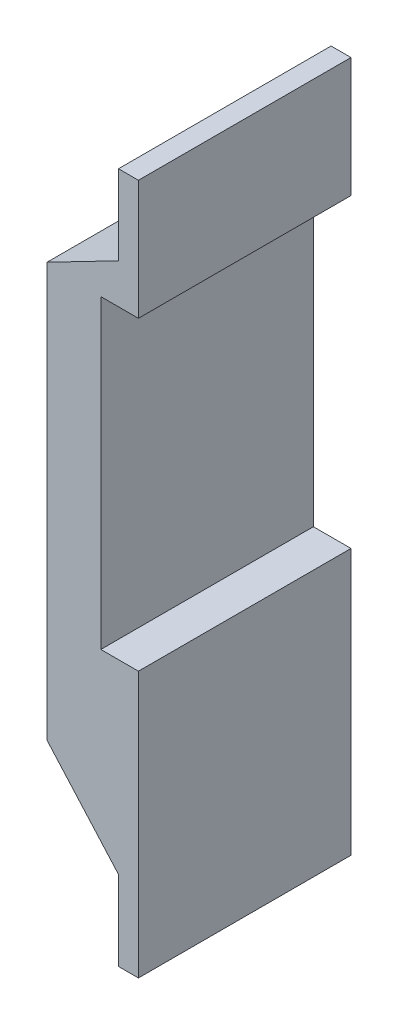
ISO-10303-21;
HEADER;
FILE_DESCRIPTION(('STEP AP214'),'2;1');
FILE_NAME('part.step','',(''),(''),'','','');
FILE_SCHEMA(('AUTOMOTIVE_DESIGN { 1 0 10303 214 1 1 1 1 }'));
ENDSEC;
DATA;
#1=APPLICATION_CONTEXT('core data for automotive mechanical design processes');
#2=APPLICATION_PROTOCOL_DEFINITION('international standard','automotive_design',2000,#1);
#3=PRODUCT_CONTEXT('',#1,'mechanical');
#4=PRODUCT('Part','Part','',(#3));
#5=PRODUCT_RELATED_PRODUCT_CATEGORY('part','',(#4));
#6=PRODUCT_DEFINITION_FORMATION('','',#4);
#7=PRODUCT_DEFINITION_CONTEXT('part definition',#1,'design');
#8=PRODUCT_DEFINITION('design','',#6,#7);
#9=PRODUCT_DEFINITION_SHAPE('','',#8);
#10=(LENGTH_UNIT() NAMED_UNIT(*) SI_UNIT(.MILLI.,.METRE.));
#11=(NAMED_UNIT(*) PLANE_ANGLE_UNIT() SI_UNIT($,.RADIAN.));
#12=(NAMED_UNIT(*) SI_UNIT($,.STERADIAN.) SOLID_ANGLE_UNIT());
#13=UNCERTAINTY_MEASURE_WITH_UNIT(LENGTH_MEASURE(1.E-05),#10,'distance_accuracy_value','');
#14=(GEOMETRIC_REPRESENTATION_CONTEXT(3) GLOBAL_UNCERTAINTY_ASSIGNED_CONTEXT((#13)) GLOBAL_UNIT_ASSIGNED_CONTEXT((#10,
#11,#12)) REPRESENTATION_CONTEXT('',''));
#15=CARTESIAN_POINT('',(0.,0.,0.));
#16=DIRECTION('',(0.,0.,1.));
#17=DIRECTION('',(1.,0.,0.));
#18=AXIS2_PLACEMENT_3D('',#15,#16,#17);
#19=CARTESIAN_POINT('',(0.,22.6727268427781,16.));
#20=DIRECTION('',(1.,0.,0.));
#21=DIRECTION('',(0.,1.,0.));
#22=AXIS2_PLACEMENT_3D('',#19,#20,#21);
#23=PLANE('',#22);
#24=DIRECTION('',(0.,-1.,0.));
#25=VECTOR('',#24,1.);
#26=CARTESIAN_POINT('',(0.,22.6727268427781,0.));
#27=LINE('',#26,#25);
#28=CARTESIAN_POINT('',(0.,22.6727268427781,0.));
#29=VERTEX_POINT('',#28);
#30=CARTESIAN_POINT('',(0.,16.6727268427781,0.));
#31=VERTEX_POINT('',#30);
#32=EDGE_CURVE('E157',#29,#31,#27,.T.);
#33=ORIENTED_EDGE('',*,*,#32,.T.);
#34=DIRECTION('',(0.,0.,-1.));
#35=VECTOR('',#34,1.);
#36=CARTESIAN_POINT('',(0.,16.6727268427781,16.));
#37=LINE('',#36,#35);
#38=CARTESIAN_POINT('',(0.,16.6727268427781,16.));
#39=VERTEX_POINT('',#38);
#40=EDGE_CURVE('E11',#39,#31,#37,.T.);
#41=ORIENTED_EDGE('',*,*,#40,.F.);
#42=DIRECTION('',(0.,-1.,0.));
#43=VECTOR('',#42,1.);
#44=CARTESIAN_POINT('',(0.,22.6727268427781,16.));
#45=LINE('',#44,#43);
#46=CARTESIAN_POINT('',(0.,22.6727268427781,16.));
#47=VERTEX_POINT('',#46);
#48=EDGE_CURVE('E179',#47,#39,#45,.T.);
#49=ORIENTED_EDGE('',*,*,#48,.F.);
#50=DIRECTION('',(0.,0.,-1.));
#51=VECTOR('',#50,1.);
#52=CARTESIAN_POINT('',(0.,22.6727268427781,16.));
#53=LINE('',#52,#51);
#54=EDGE_CURVE('E153',#47,#29,#53,.T.);
#55=ORIENTED_EDGE('',*,*,#54,.T.);
#56=EDGE_LOOP('',(#33,#41,#49,#55));
#57=FACE_BOUND('',#56,.T.);
#58=ADVANCED_FACE('F37',(#57),#23,.F.);
#59=CARTESIAN_POINT('',(0.,16.6727268427781,16.));
#60=DIRECTION('',(0.459763152914506,-0.888041577417473,0.));
#61=DIRECTION('',(0.888041577417472,0.459763152914506,0.));
#62=AXIS2_PLACEMENT_3D('',#59,#60,#61);
#63=PLANE('',#62);
#64=DIRECTION('',(-0.888041577417472,-0.459763152914506,0.));
#65=VECTOR('',#64,1.);
#66=CARTESIAN_POINT('',(0.,16.6727268427781,0.));
#67=LINE('',#66,#65);
#68=CARTESIAN_POINT('',(-5.38153195914988,13.8865621361162,0.));
#69=VERTEX_POINT('',#68);
#70=EDGE_CURVE('E160',#31,#69,#67,.T.);
#71=ORIENTED_EDGE('',*,*,#70,.T.);
#72=DIRECTION('',(0.,0.,-1.));
#73=VECTOR('',#72,1.);
#74=CARTESIAN_POINT('',(-5.38153195914988,13.8865621361162,16.));
#75=LINE('',#74,#73);
#76=CARTESIAN_POINT('',(-5.38153195914988,13.8865621361162,16.));
#77=VERTEX_POINT('',#76);
#78=EDGE_CURVE('E45',#77,#69,#75,.T.);
#79=ORIENTED_EDGE('',*,*,#78,.F.);
#80=DIRECTION('',(-0.888041577417472,-0.459763152914506,0.));
#81=VECTOR('',#80,1.);
#82=CARTESIAN_POINT('',(0.,16.6727268427781,16.));
#83=LINE('',#82,#81);
#84=EDGE_CURVE('E108',#39,#77,#83,.T.);
#85=ORIENTED_EDGE('',*,*,#84,.F.);
#86=ORIENTED_EDGE('',*,*,#40,.T.);
#87=EDGE_LOOP('',(#71,#79,#85,#86));
#88=FACE_BOUND('',#87,.T.);
#89=ADVANCED_FACE('F257',(#88),#63,.F.);
#90=CARTESIAN_POINT('',(-5.38153195914988,13.8865621361162,16.));
#91=DIRECTION('',(1.,0.,0.));
#92=DIRECTION('',(0.,1.,0.));
#93=AXIS2_PLACEMENT_3D('',#90,#91,#92);
#94=PLANE('',#93);
#95=DIRECTION('',(0.,-1.,0.));
#96=VECTOR('',#95,1.);
#97=CARTESIAN_POINT('',(-5.38153195914988,13.8865621361162,0.));
#98=LINE('',#97,#96);
#99=CARTESIAN_POINT('',(-5.38153195914988,-17.2672731572219,0.));
#100=VERTEX_POINT('',#99);
#101=EDGE_CURVE('E162',#69,#100,#98,.T.);
#102=ORIENTED_EDGE('',*,*,#101,.T.);
#103=DIRECTION('',(0.,0.,-1.));
#104=VECTOR('',#103,1.);
#105=CARTESIAN_POINT('',(-5.38153195914988,-17.2672731572219,16.));
#106=LINE('',#105,#104);
#107=CARTESIAN_POINT('',(-5.38153195914988,-17.2672731572219,16.));
#108=VERTEX_POINT('',#107);
#109=EDGE_CURVE('E198',#108,#100,#106,.T.);
#110=ORIENTED_EDGE('',*,*,#109,.F.);
#111=DIRECTION('',(0.,-1.,0.));
#112=VECTOR('',#111,1.);
#113=CARTESIAN_POINT('',(-5.38153195914988,13.8865621361162,16.));
#114=LINE('',#113,#112);
#115=EDGE_CURVE('E206',#77,#108,#114,.T.);
#116=ORIENTED_EDGE('',*,*,#115,.F.);
#117=ORIENTED_EDGE('',*,*,#78,.T.);
#118=EDGE_LOOP('',(#102,#110,#116,#117));
#119=FACE_BOUND('',#118,.T.);
#120=ADVANCED_FACE('F204',(#119),#94,.F.);
#121=CARTESIAN_POINT('',(-5.38153195914988,-17.2672731572219,16.));
#122=DIRECTION('',(0.74772382770542,0.664009847428151,0.));
#123=DIRECTION('',(-0.664009847428151,0.74772382770542,0.));
#124=AXIS2_PLACEMENT_3D('',#121,#122,#123);
#125=PLANE('',#124);
#126=DIRECTION('',(0.664009847428151,-0.74772382770542,0.));
#127=VECTOR('',#126,1.);
#128=CARTESIAN_POINT('',(-5.38153195914988,-17.2672731572219,0.));
#129=LINE('',#128,#127);
#130=CARTESIAN_POINT('',(0.,-23.3272731572219,0.));
#131=VERTEX_POINT('',#130);
#132=EDGE_CURVE('E164',#100,#131,#129,.T.);
#133=ORIENTED_EDGE('',*,*,#132,.T.);
#134=DIRECTION('',(0.,0.,-1.));
#135=VECTOR('',#134,1.);
#136=CARTESIAN_POINT('',(0.,-23.3272731572219,16.));
#137=LINE('',#136,#135);
#138=CARTESIAN_POINT('',(0.,-23.3272731572219,16.));
#139=VERTEX_POINT('',#138);
#140=EDGE_CURVE('E195',#139,#131,#137,.T.);
#141=ORIENTED_EDGE('',*,*,#140,.F.);
#142=DIRECTION('',(0.664009847428151,-0.74772382770542,0.));
#143=VECTOR('',#142,1.);
#144=CARTESIAN_POINT('',(-5.38153195914988,-17.2672731572219,16.));
#145=LINE('',#144,#143);
#146=EDGE_CURVE('E224',#108,#139,#145,.T.);
#147=ORIENTED_EDGE('',*,*,#146,.F.);
#148=ORIENTED_EDGE('',*,*,#109,.T.);
#149=EDGE_LOOP('',(#133,#141,#147,#148));
#150=FACE_BOUND('',#149,.T.);
#151=ADVANCED_FACE('F215',(#150),#125,.F.);
#152=CARTESIAN_POINT('',(0.,-23.3272731572219,16.));
#153=DIRECTION('',(1.,0.,0.));
#154=DIRECTION('',(0.,1.,0.));
#155=AXIS2_PLACEMENT_3D('',#152,#153,#154);
#156=PLANE('',#155);
#157=DIRECTION('',(0.,-1.,0.));
#158=VECTOR('',#157,1.);
#159=CARTESIAN_POINT('',(0.,-23.3272731572219,0.));
#160=LINE('',#159,#158);
#161=CARTESIAN_POINT('',(0.,-29.3272731572219,0.));
#162=VERTEX_POINT('',#161);
#163=EDGE_CURVE('E166',#131,#162,#160,.T.);
#164=ORIENTED_EDGE('',*,*,#163,.T.);
#165=DIRECTION('',(0.,0.,-1.));
#166=VECTOR('',#165,1.);
#167=CARTESIAN_POINT('',(0.,-29.3272731572219,16.));
#168=LINE('',#167,#166);
#169=CARTESIAN_POINT('',(0.,-29.3272731572219,16.));
#170=VERTEX_POINT('',#169);
#171=EDGE_CURVE('E192',#170,#162,#168,.T.);
#172=ORIENTED_EDGE('',*,*,#171,.F.);
#173=DIRECTION('',(0.,-1.,0.));
#174=VECTOR('',#173,1.);
#175=CARTESIAN_POINT('',(0.,-23.3272731572219,16.));
#176=LINE('',#175,#174);
#177=EDGE_CURVE('E221',#139,#170,#176,.T.);
#178=ORIENTED_EDGE('',*,*,#177,.F.);
#179=ORIENTED_EDGE('',*,*,#140,.T.);
#180=EDGE_LOOP('',(#164,#172,#178,#179));
#181=FACE_BOUND('',#180,.T.);
#182=ADVANCED_FACE('F219',(#181),#156,.F.);
#183=CARTESIAN_POINT('',(1.5,-29.3272731572219,16.));
#184=DIRECTION('',(0.,1.,0.));
#185=DIRECTION('',(0.,0.,1.));
#186=AXIS2_PLACEMENT_3D('',#183,#184,#185);
#187=PLANE('',#186);
#188=DIRECTION('',(1.,0.,0.));
#189=VECTOR('',#188,1.);
#190=CARTESIAN_POINT('',(1.5,-29.3272731572219,0.));
#191=LINE('',#190,#189);
#192=CARTESIAN_POINT('',(1.5,-29.3272731572219,0.));
#193=VERTEX_POINT('',#192);
#194=EDGE_CURVE('E168',#162,#193,#191,.T.);
#195=ORIENTED_EDGE('',*,*,#194,.T.);
#196=DIRECTION('',(0.,0.,-1.));
#197=VECTOR('',#196,1.);
#198=CARTESIAN_POINT('',(1.5,-29.3272731572219,16.));
#199=LINE('',#198,#197);
#200=CARTESIAN_POINT('',(1.5,-29.3272731572219,16.));
#201=VERTEX_POINT('',#200);
#202=EDGE_CURVE('E189',#201,#193,#199,.T.);
#203=ORIENTED_EDGE('',*,*,#202,.F.);
#204=DIRECTION('',(1.,0.,0.));
#205=VECTOR('',#204,1.);
#206=CARTESIAN_POINT('',(1.5,-29.3272731572219,16.));
#207=LINE('',#206,#205);
#208=EDGE_CURVE('E223',#170,#201,#207,.T.);
#209=ORIENTED_EDGE('',*,*,#208,.F.);
#210=ORIENTED_EDGE('',*,*,#171,.T.);
#211=EDGE_LOOP('',(#195,#203,#209,#210));
#212=FACE_BOUND('',#211,.T.);
#213=ADVANCED_FACE('F270',(#212),#187,.F.);
#214=CARTESIAN_POINT('',(1.5,-9.32727315722191,16.));
#215=DIRECTION('',(-1.,0.,0.));
#216=DIRECTION('',(0.,-1.,0.));
#217=AXIS2_PLACEMENT_3D('',#214,#215,#216);
#218=PLANE('',#217);
#219=DIRECTION('',(0.,1.,0.));
#220=VECTOR('',#219,1.);
#221=CARTESIAN_POINT('',(1.5,-9.32727315722191,0.));
#222=LINE('',#221,#220);
#223=CARTESIAN_POINT('',(1.5,-9.32727315722191,0.));
#224=VERTEX_POINT('',#223);
#225=EDGE_CURVE('E170',#193,#224,#222,.T.);
#226=ORIENTED_EDGE('',*,*,#225,.T.);
#227=DIRECTION('',(0.,0.,-1.));
#228=VECTOR('',#227,1.);
#229=CARTESIAN_POINT('',(1.5,-9.32727315722191,16.));
#230=LINE('',#229,#228);
#231=CARTESIAN_POINT('',(1.5,-9.32727315722191,16.));
#232=VERTEX_POINT('',#231);
#233=EDGE_CURVE('E186',#232,#224,#230,.T.);
#234=ORIENTED_EDGE('',*,*,#233,.F.);
#235=DIRECTION('',(0.,1.,0.));
#236=VECTOR('',#235,1.);
#237=CARTESIAN_POINT('',(1.5,-9.32727315722191,16.));
#238=LINE('',#237,#236);
#239=EDGE_CURVE('E226',#201,#232,#238,.T.);
#240=ORIENTED_EDGE('',*,*,#239,.F.);
#241=ORIENTED_EDGE('',*,*,#202,.T.);
#242=EDGE_LOOP('',(#226,#234,#240,#241));
#243=FACE_BOUND('',#242,.T.);
#244=ADVANCED_FACE('F273',(#243),#218,.F.);
#245=CARTESIAN_POINT('',(-1.33,-9.32727315722191,16.));
#246=DIRECTION('',(0.,-1.,0.));
#247=DIRECTION('',(1.,0.,0.));
#248=AXIS2_PLACEMENT_3D('',#245,#246,#247);
#249=PLANE('',#248);
#250=DIRECTION('',(-1.,0.,0.));
#251=VECTOR('',#250,1.);
#252=CARTESIAN_POINT('',(-1.33,-9.32727315722191,0.));
#253=LINE('',#252,#251);
#254=CARTESIAN_POINT('',(-1.33,-9.32727315722191,0.));
#255=VERTEX_POINT('',#254);
#256=EDGE_CURVE('E172',#224,#255,#253,.T.);
#257=ORIENTED_EDGE('',*,*,#256,.T.);
#258=DIRECTION('',(0.,0.,-1.));
#259=VECTOR('',#258,1.);
#260=CARTESIAN_POINT('',(-1.33,-9.32727315722191,16.));
#261=LINE('',#260,#259);
#262=CARTESIAN_POINT('',(-1.33,-9.32727315722191,16.));
#263=VERTEX_POINT('',#262);
#264=EDGE_CURVE('E183',#263,#255,#261,.T.);
#265=ORIENTED_EDGE('',*,*,#264,.F.);
#266=DIRECTION('',(-1.,0.,0.));
#267=VECTOR('',#266,1.);
#268=CARTESIAN_POINT('',(-1.33,-9.32727315722191,16.));
#269=LINE('',#268,#267);
#270=EDGE_CURVE('E232',#232,#263,#269,.T.);
#271=ORIENTED_EDGE('',*,*,#270,.F.);
#272=ORIENTED_EDGE('',*,*,#233,.T.);
#273=EDGE_LOOP('',(#257,#265,#271,#272));
#274=FACE_BOUND('',#273,.T.);
#275=ADVANCED_FACE('F238',(#274),#249,.F.);
#276=CARTESIAN_POINT('',(-1.33,13.6727268427781,16.));
#277=DIRECTION('',(-1.,0.,0.));
#278=DIRECTION('',(0.,-1.,0.));
#279=AXIS2_PLACEMENT_3D('',#276,#277,#278);
#280=PLANE('',#279);
#281=DIRECTION('',(0.,1.,0.));
#282=VECTOR('',#281,1.);
#283=CARTESIAN_POINT('',(-1.33,13.6727268427781,0.));
#284=LINE('',#283,#282);
#285=CARTESIAN_POINT('',(-1.33,13.6727268427781,0.));
#286=VERTEX_POINT('',#285);
#287=EDGE_CURVE('E174',#255,#286,#284,.T.);
#288=ORIENTED_EDGE('',*,*,#287,.T.);
#289=DIRECTION('',(0.,0.,-1.));
#290=VECTOR('',#289,1.);
#291=CARTESIAN_POINT('',(-1.33,13.6727268427781,16.));
#292=LINE('',#291,#290);
#293=CARTESIAN_POINT('',(-1.33,13.6727268427781,16.));
#294=VERTEX_POINT('',#293);
#295=EDGE_CURVE('E148',#294,#286,#292,.T.);
#296=ORIENTED_EDGE('',*,*,#295,.F.);
#297=DIRECTION('',(0.,1.,0.));
#298=VECTOR('',#297,1.);
#299=CARTESIAN_POINT('',(-1.33,13.6727268427781,16.));
#300=LINE('',#299,#298);
#301=EDGE_CURVE('E139',#263,#294,#300,.T.);
#302=ORIENTED_EDGE('',*,*,#301,.F.);
#303=ORIENTED_EDGE('',*,*,#264,.T.);
#304=EDGE_LOOP('',(#288,#296,#302,#303));
#305=FACE_BOUND('',#304,.T.);
#306=ADVANCED_FACE('F242',(#305),#280,.F.);
#307=CARTESIAN_POINT('',(1.5,13.6727268427781,16.));
#308=DIRECTION('',(0.,1.,0.));
#309=DIRECTION('',(0.,0.,1.));
#310=AXIS2_PLACEMENT_3D('',#307,#308,#309);
#311=PLANE('',#310);
#312=DIRECTION('',(1.,0.,0.));
#313=VECTOR('',#312,1.);
#314=CARTESIAN_POINT('',(1.5,13.6727268427781,0.));
#315=LINE('',#314,#313);
#316=CARTESIAN_POINT('',(1.5,13.6727268427781,0.));
#317=VERTEX_POINT('',#316);
#318=EDGE_CURVE('E147',#286,#317,#315,.T.);
#319=ORIENTED_EDGE('',*,*,#318,.T.);
#320=DIRECTION('',(0.,0.,-1.));
#321=VECTOR('',#320,1.);
#322=CARTESIAN_POINT('',(1.5,13.6727268427781,16.));
#323=LINE('',#322,#321);
#324=CARTESIAN_POINT('',(1.5,13.6727268427781,16.));
#325=VERTEX_POINT('',#324);
#326=EDGE_CURVE('E144',#325,#317,#323,.T.);
#327=ORIENTED_EDGE('',*,*,#326,.F.);
#328=DIRECTION('',(1.,0.,0.));
#329=VECTOR('',#328,1.);
#330=CARTESIAN_POINT('',(1.5,13.6727268427781,16.));
#331=LINE('',#330,#329);
#332=EDGE_CURVE('E133',#294,#325,#331,.T.);
#333=ORIENTED_EDGE('',*,*,#332,.F.);
#334=ORIENTED_EDGE('',*,*,#295,.T.);
#335=EDGE_LOOP('',(#319,#327,#333,#334));
#336=FACE_BOUND('',#335,.T.);
#337=ADVANCED_FACE('F145',(#336),#311,.F.);
#338=CARTESIAN_POINT('',(1.5,22.6727268427781,16.));
#339=DIRECTION('',(-1.,0.,0.));
#340=DIRECTION('',(0.,-1.,0.));
#341=AXIS2_PLACEMENT_3D('',#338,#339,#340);
#342=PLANE('',#341);
#343=DIRECTION('',(0.,1.,0.));
#344=VECTOR('',#343,1.);
#345=CARTESIAN_POINT('',(1.5,22.6727268427781,0.));
#346=LINE('',#345,#344);
#347=CARTESIAN_POINT('',(1.5,22.6727268427781,0.));
#348=VERTEX_POINT('',#347);
#349=EDGE_CURVE('E94',#317,#348,#346,.T.);
#350=ORIENTED_EDGE('',*,*,#349,.T.);
#351=DIRECTION('',(0.,0.,-1.));
#352=VECTOR('',#351,1.);
#353=CARTESIAN_POINT('',(1.5,22.6727268427781,16.));
#354=LINE('',#353,#352);
#355=CARTESIAN_POINT('',(1.5,22.6727268427781,16.));
#356=VERTEX_POINT('',#355);
#357=EDGE_CURVE('E149',#356,#348,#354,.T.);
#358=ORIENTED_EDGE('',*,*,#357,.F.);
#359=DIRECTION('',(0.,1.,0.));
#360=VECTOR('',#359,1.);
#361=CARTESIAN_POINT('',(1.5,22.6727268427781,16.));
#362=LINE('',#361,#360);
#363=EDGE_CURVE('E137',#325,#356,#362,.T.);
#364=ORIENTED_EDGE('',*,*,#363,.F.);
#365=ORIENTED_EDGE('',*,*,#326,.T.);
#366=EDGE_LOOP('',(#350,#358,#364,#365));
#367=FACE_BOUND('',#366,.T.);
#368=ADVANCED_FACE('F151',(#367),#342,.F.);
#369=CARTESIAN_POINT('',(0.,22.6727268427781,16.));
#370=DIRECTION('',(0.,-1.,0.));
#371=DIRECTION('',(0.,0.,-1.));
#372=AXIS2_PLACEMENT_3D('',#369,#370,#371);
#373=PLANE('',#372);
#374=DIRECTION('',(-1.,0.,0.));
#375=VECTOR('',#374,1.);
#376=CARTESIAN_POINT('',(0.,22.6727268427781,0.));
#377=LINE('',#376,#375);
#378=EDGE_CURVE('E100',#348,#29,#377,.T.);
#379=ORIENTED_EDGE('',*,*,#378,.T.);
#380=ORIENTED_EDGE('',*,*,#54,.F.);
#381=DIRECTION('',(-1.,0.,0.));
#382=VECTOR('',#381,1.);
#383=CARTESIAN_POINT('',(0.,22.6727268427781,16.));
#384=LINE('',#383,#382);
#385=EDGE_CURVE('E53',#356,#47,#384,.T.);
#386=ORIENTED_EDGE('',*,*,#385,.F.);
#387=ORIENTED_EDGE('',*,*,#357,.T.);
#388=EDGE_LOOP('',(#379,#380,#386,#387));
#389=FACE_BOUND('',#388,.T.);
#390=ADVANCED_FACE('F246',(#389),#373,.F.);
#391=CARTESIAN_POINT('',(0.,0.,16.));
#392=DIRECTION('',(0.,0.,-1.));
#393=DIRECTION('',(-1.,0.,0.));
#394=AXIS2_PLACEMENT_3D('',#391,#392,#393);
#395=PLANE('',#394);
#396=ORIENTED_EDGE('',*,*,#48,.T.);
#397=ORIENTED_EDGE('',*,*,#84,.T.);
#398=ORIENTED_EDGE('',*,*,#115,.T.);
#399=ORIENTED_EDGE('',*,*,#146,.T.);
#400=ORIENTED_EDGE('',*,*,#177,.T.);
#401=ORIENTED_EDGE('',*,*,#208,.T.);
#402=ORIENTED_EDGE('',*,*,#239,.T.);
#403=ORIENTED_EDGE('',*,*,#270,.T.);
#404=ORIENTED_EDGE('',*,*,#301,.T.);
#405=ORIENTED_EDGE('',*,*,#332,.T.);
#406=ORIENTED_EDGE('',*,*,#363,.T.);
#407=ORIENTED_EDGE('',*,*,#385,.T.);
#408=EDGE_LOOP('',(#396,#397,#398,#399,#400,#401,#402,#403,#404,#405,#406,#407));
#409=FACE_BOUND('',#408,.T.);
#410=ADVANCED_FACE('F135',(#409),#395,.F.);
#411=CARTESIAN_POINT('',(0.,0.,0.));
#412=DIRECTION('',(0.,0.,-1.));
#413=DIRECTION('',(-1.,0.,0.));
#414=AXIS2_PLACEMENT_3D('',#411,#412,#413);
#415=PLANE('',#414);
#416=ORIENTED_EDGE('',*,*,#32,.F.);
#417=ORIENTED_EDGE('',*,*,#378,.F.);
#418=ORIENTED_EDGE('',*,*,#349,.F.);
#419=ORIENTED_EDGE('',*,*,#318,.F.);
#420=ORIENTED_EDGE('',*,*,#287,.F.);
#421=ORIENTED_EDGE('',*,*,#256,.F.);
#422=ORIENTED_EDGE('',*,*,#225,.F.);
#423=ORIENTED_EDGE('',*,*,#194,.F.);
#424=ORIENTED_EDGE('',*,*,#163,.F.);
#425=ORIENTED_EDGE('',*,*,#132,.F.);
#426=ORIENTED_EDGE('',*,*,#101,.F.);
#427=ORIENTED_EDGE('',*,*,#70,.F.);
#428=EDGE_LOOP('',(#416,#417,#418,#419,#420,#421,#422,#423,#424,#425,#426,#427));
#429=FACE_BOUND('',#428,.T.);
#430=ADVANCED_FACE('F210',(#429),#415,.T.);
#431=CLOSED_SHELL('',(#58,#89,#120,#151,#182,#213,#244,#275,#306,#337,#368,#390,#410,#430));
#432=MANIFOLD_SOLID_BREP('B2',#431);
#433=ADVANCED_BREP_SHAPE_REPRESENTATION('',(#18,#432),#14);
#434=SHAPE_DEFINITION_REPRESENTATION(#9,#433);
ENDSEC;
END-ISO-10303-21;
